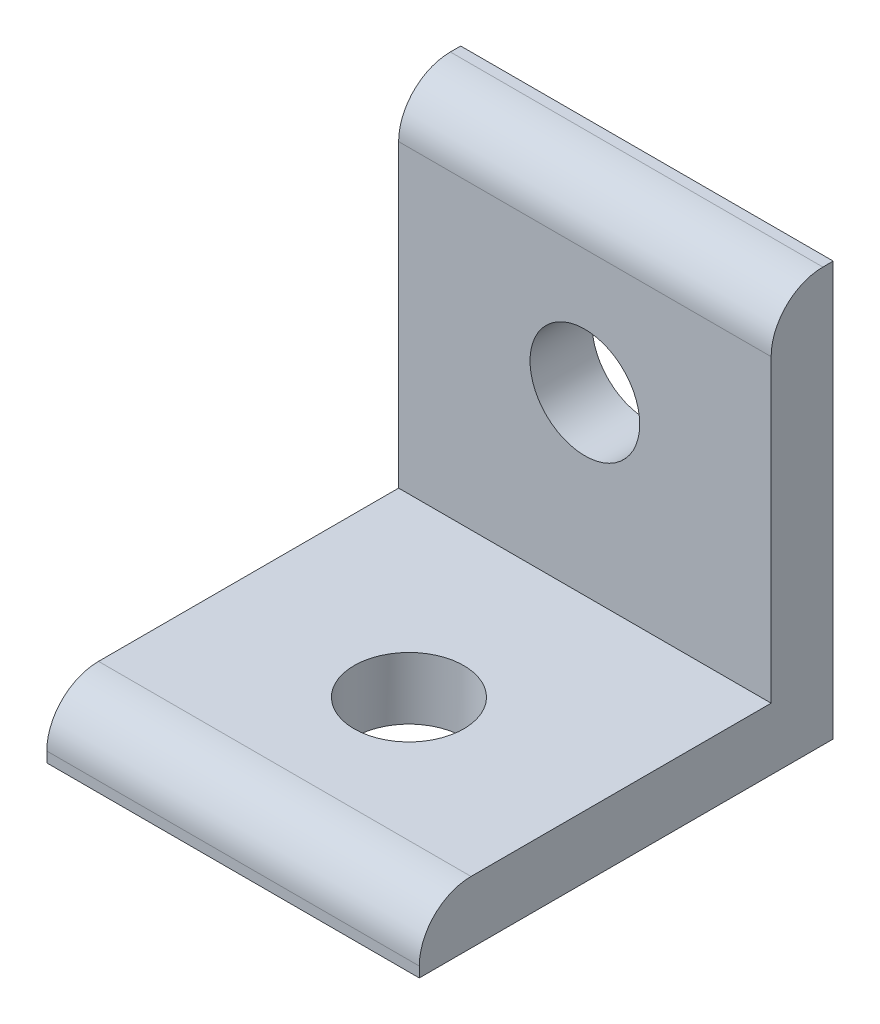
ISO-10303-21;
HEADER;
FILE_DESCRIPTION(('STEP AP214'),'2;1');
FILE_NAME('part.step','',(''),(''),'','','');
FILE_SCHEMA(('AUTOMOTIVE_DESIGN { 1 0 10303 214 1 1 1 1 }'));
ENDSEC;
DATA;
#1=APPLICATION_CONTEXT('core data for automotive mechanical design processes');
#2=APPLICATION_PROTOCOL_DEFINITION('international standard','automotive_design',2000,#1);
#3=PRODUCT_CONTEXT('',#1,'mechanical');
#4=PRODUCT('Part','Part','',(#3));
#5=PRODUCT_RELATED_PRODUCT_CATEGORY('part','',(#4));
#6=PRODUCT_DEFINITION_FORMATION('','',#4);
#7=PRODUCT_DEFINITION_CONTEXT('part definition',#1,'design');
#8=PRODUCT_DEFINITION('design','',#6,#7);
#9=PRODUCT_DEFINITION_SHAPE('','',#8);
#10=(LENGTH_UNIT() NAMED_UNIT(*) SI_UNIT(.MILLI.,.METRE.));
#11=(NAMED_UNIT(*) PLANE_ANGLE_UNIT() SI_UNIT($,.RADIAN.));
#12=(NAMED_UNIT(*) SI_UNIT($,.STERADIAN.) SOLID_ANGLE_UNIT());
#13=UNCERTAINTY_MEASURE_WITH_UNIT(LENGTH_MEASURE(1.E-05),#10,'distance_accuracy_value','');
#14=(GEOMETRIC_REPRESENTATION_CONTEXT(3) GLOBAL_UNCERTAINTY_ASSIGNED_CONTEXT((#13)) GLOBAL_UNIT_ASSIGNED_CONTEXT((#10,
#11,#12)) REPRESENTATION_CONTEXT('',''));
#15=CARTESIAN_POINT('',(0.,0.,0.));
#16=DIRECTION('',(0.,0.,1.));
#17=DIRECTION('',(1.,0.,0.));
#18=AXIS2_PLACEMENT_3D('',#15,#16,#17);
#19=CARTESIAN_POINT('',(0.,3.,0.));
#20=DIRECTION('',(0.,-1.,0.));
#21=DIRECTION('',(0.,0.,-1.));
#22=AXIS2_PLACEMENT_3D('',#19,#20,#21);
#23=PLANE('',#22);
#24=CARTESIAN_POINT('',(9.00000000000001,3.,11.5));
#25=DIRECTION('',(0.,1.,0.));
#26=DIRECTION('',(0.,0.,1.));
#27=AXIS2_PLACEMENT_3D('',#24,#25,#26);
#28=CIRCLE('',#27,2.65);
#29=CARTESIAN_POINT('',(9.00000000000001,3.,14.15));
#30=VERTEX_POINT('',#29);
#31=EDGE_CURVE('E227',#30,#30,#28,.T.);
#32=ORIENTED_EDGE('',*,*,#31,.F.);
#33=EDGE_LOOP('',(#32));
#34=FACE_BOUND('',#33,.T.);
#35=DIRECTION('',(0.,0.,-1.));
#36=VECTOR('',#35,1.);
#37=CARTESIAN_POINT('',(0.,3.,20.));
#38=LINE('',#37,#36);
#39=CARTESIAN_POINT('',(0.,3.,17.5));
#40=VERTEX_POINT('',#39);
#41=CARTESIAN_POINT('',(0.,3.,3.));
#42=VERTEX_POINT('',#41);
#43=EDGE_CURVE('E145',#40,#42,#38,.T.);
#44=ORIENTED_EDGE('',*,*,#43,.F.);
#45=DIRECTION('',(-1.,0.,0.));
#46=VECTOR('',#45,1.);
#47=CARTESIAN_POINT('',(18.,3.,17.5));
#48=LINE('',#47,#46);
#49=CARTESIAN_POINT('',(18.,3.,17.5));
#50=VERTEX_POINT('',#49);
#51=EDGE_CURVE('E11',#40,#50,#48,.F.);
#52=ORIENTED_EDGE('',*,*,#51,.T.);
#53=DIRECTION('',(0.,0.,1.));
#54=VECTOR('',#53,1.);
#55=CARTESIAN_POINT('',(18.,3.,0.));
#56=LINE('',#55,#54);
#57=CARTESIAN_POINT('',(18.,3.,3.));
#58=VERTEX_POINT('',#57);
#59=EDGE_CURVE('E147',#58,#50,#56,.T.);
#60=ORIENTED_EDGE('',*,*,#59,.F.);
#61=DIRECTION('',(1.,0.,0.));
#62=VECTOR('',#61,1.);
#63=CARTESIAN_POINT('',(18.,3.,3.));
#64=LINE('',#63,#62);
#65=EDGE_CURVE('E138',#42,#58,#64,.T.);
#66=ORIENTED_EDGE('',*,*,#65,.F.);
#67=EDGE_LOOP('',(#44,#52,#60,#66));
#68=FACE_BOUND('',#67,.T.);
#69=ADVANCED_FACE('F43',(#34,#68),#23,.F.);
#70=CARTESIAN_POINT('',(18.,3.,20.));
#71=DIRECTION('',(0.,0.,1.));
#72=DIRECTION('',(1.,0.,0.));
#73=AXIS2_PLACEMENT_3D('',#70,#71,#72);
#74=PLANE('',#73);
#75=DIRECTION('',(0.,-1.,0.));
#76=VECTOR('',#75,1.);
#77=CARTESIAN_POINT('',(18.,3.,20.));
#78=LINE('',#77,#76);
#79=CARTESIAN_POINT('',(18.,0.5,20.));
#80=VERTEX_POINT('',#79);
#81=CARTESIAN_POINT('',(18.,0.,20.));
#82=VERTEX_POINT('',#81);
#83=EDGE_CURVE('E128',#80,#82,#78,.T.);
#84=ORIENTED_EDGE('',*,*,#83,.F.);
#85=DIRECTION('',(-1.,0.,0.));
#86=VECTOR('',#85,1.);
#87=CARTESIAN_POINT('',(0.,0.5,20.));
#88=LINE('',#87,#86);
#89=CARTESIAN_POINT('',(0.,0.5,20.));
#90=VERTEX_POINT('',#89);
#91=EDGE_CURVE('E51',#80,#90,#88,.T.);
#92=ORIENTED_EDGE('',*,*,#91,.T.);
#93=DIRECTION('',(0.,-1.,0.));
#94=VECTOR('',#93,1.);
#95=CARTESIAN_POINT('',(0.,3.,20.));
#96=LINE('',#95,#94);
#97=CARTESIAN_POINT('',(0.,0.,20.));
#98=VERTEX_POINT('',#97);
#99=EDGE_CURVE('E150',#90,#98,#96,.T.);
#100=ORIENTED_EDGE('',*,*,#99,.T.);
#101=DIRECTION('',(-1.,0.,0.));
#102=VECTOR('',#101,1.);
#103=CARTESIAN_POINT('',(18.,0.,20.));
#104=LINE('',#103,#102);
#105=EDGE_CURVE('E144',#82,#98,#104,.T.);
#106=ORIENTED_EDGE('',*,*,#105,.F.);
#107=EDGE_LOOP('',(#84,#92,#100,#106));
#108=FACE_BOUND('',#107,.T.);
#109=ADVANCED_FACE('F173',(#108),#74,.T.);
#110=CARTESIAN_POINT('',(18.,3.,0.));
#111=DIRECTION('',(1.,0.,0.));
#112=DIRECTION('',(0.,0.,-1.));
#113=AXIS2_PLACEMENT_3D('',#110,#111,#112);
#114=PLANE('',#113);
#115=DIRECTION('',(0.,0.,-1.));
#116=VECTOR('',#115,1.);
#117=CARTESIAN_POINT('',(18.,20.,0.));
#118=LINE('',#117,#116);
#119=CARTESIAN_POINT('',(18.,20.,0.5));
#120=VERTEX_POINT('',#119);
#121=CARTESIAN_POINT('',(18.,20.,0.));
#122=VERTEX_POINT('',#121);
#123=EDGE_CURVE('E108',#120,#122,#118,.T.);
#124=ORIENTED_EDGE('',*,*,#123,.F.);
#125=CARTESIAN_POINT('',(18.,17.5,0.5));
#126=DIRECTION('',(1.,0.,0.));
#127=DIRECTION('',(0.,0.,-1.));
#128=AXIS2_PLACEMENT_3D('',#125,#126,#127);
#129=CIRCLE('',#128,2.5);
#130=CARTESIAN_POINT('',(18.,17.5,3.));
#131=VERTEX_POINT('',#130);
#132=EDGE_CURVE('E165',#120,#131,#129,.T.);
#133=ORIENTED_EDGE('',*,*,#132,.T.);
#134=DIRECTION('',(0.,-1.,0.));
#135=VECTOR('',#134,1.);
#136=CARTESIAN_POINT('',(18.,20.,3.));
#137=LINE('',#136,#135);
#138=EDGE_CURVE('E132',#131,#58,#137,.T.);
#139=ORIENTED_EDGE('',*,*,#138,.T.);
#140=ORIENTED_EDGE('',*,*,#59,.T.);
#141=CARTESIAN_POINT('',(18.,0.5,17.5));
#142=DIRECTION('',(1.,0.,0.));
#143=DIRECTION('',(0.,0.,-1.));
#144=AXIS2_PLACEMENT_3D('',#141,#142,#143);
#145=CIRCLE('',#144,2.5);
#146=EDGE_CURVE('E163',#50,#80,#145,.T.);
#147=ORIENTED_EDGE('',*,*,#146,.T.);
#148=ORIENTED_EDGE('',*,*,#83,.T.);
#149=DIRECTION('',(0.,0.,1.));
#150=VECTOR('',#149,1.);
#151=CARTESIAN_POINT('',(18.,0.,0.));
#152=LINE('',#151,#150);
#153=CARTESIAN_POINT('',(18.,0.,0.));
#154=VERTEX_POINT('',#153);
#155=EDGE_CURVE('E124',#154,#82,#152,.T.);
#156=ORIENTED_EDGE('',*,*,#155,.F.);
#157=DIRECTION('',(0.,-1.,0.));
#158=VECTOR('',#157,1.);
#159=CARTESIAN_POINT('',(18.,3.,0.));
#160=LINE('',#159,#158);
#161=EDGE_CURVE('E121',#122,#154,#160,.T.);
#162=ORIENTED_EDGE('',*,*,#161,.F.);
#163=EDGE_LOOP('',(#124,#133,#139,#140,#147,#148,#156,#162));
#164=FACE_BOUND('',#163,.T.);
#165=ADVANCED_FACE('F122',(#164),#114,.T.);
#166=CARTESIAN_POINT('',(0.,3.,0.));
#167=DIRECTION('',(0.,0.,-1.));
#168=DIRECTION('',(-1.,0.,0.));
#169=AXIS2_PLACEMENT_3D('',#166,#167,#168);
#170=PLANE('',#169);
#171=CARTESIAN_POINT('',(9.,11.5,0.));
#172=DIRECTION('',(0.,0.,-1.));
#173=DIRECTION('',(-1.,0.,0.));
#174=AXIS2_PLACEMENT_3D('',#171,#172,#173);
#175=CIRCLE('',#174,2.65);
#176=CARTESIAN_POINT('',(11.65,11.5,0.));
#177=VERTEX_POINT('',#176);
#178=EDGE_CURVE('E225',#177,#177,#175,.F.);
#179=ORIENTED_EDGE('',*,*,#178,.T.);
#180=EDGE_LOOP('',(#179));
#181=FACE_BOUND('',#180,.T.);
#182=DIRECTION('',(1.,0.,0.));
#183=VECTOR('',#182,1.);
#184=CARTESIAN_POINT('',(0.,0.,0.));
#185=LINE('',#184,#183);
#186=CARTESIAN_POINT('',(0.,0.,0.));
#187=VERTEX_POINT('',#186);
#188=EDGE_CURVE('E156',#187,#154,#185,.T.);
#189=ORIENTED_EDGE('',*,*,#188,.F.);
#190=DIRECTION('',(0.,-1.,0.));
#191=VECTOR('',#190,1.);
#192=CARTESIAN_POINT('',(0.,3.,0.));
#193=LINE('',#192,#191);
#194=CARTESIAN_POINT('',(0.,20.,0.));
#195=VERTEX_POINT('',#194);
#196=EDGE_CURVE('E129',#195,#187,#193,.T.);
#197=ORIENTED_EDGE('',*,*,#196,.F.);
#198=DIRECTION('',(-1.,0.,0.));
#199=VECTOR('',#198,1.);
#200=CARTESIAN_POINT('',(0.,20.,0.));
#201=LINE('',#200,#199);
#202=EDGE_CURVE('E113',#122,#195,#201,.T.);
#203=ORIENTED_EDGE('',*,*,#202,.F.);
#204=ORIENTED_EDGE('',*,*,#161,.T.);
#205=EDGE_LOOP('',(#189,#197,#203,#204));
#206=FACE_BOUND('',#205,.T.);
#207=ADVANCED_FACE('F131',(#181,#206),#170,.T.);
#208=CARTESIAN_POINT('',(0.,3.,20.));
#209=DIRECTION('',(-1.,0.,0.));
#210=DIRECTION('',(0.,0.,1.));
#211=AXIS2_PLACEMENT_3D('',#208,#209,#210);
#212=PLANE('',#211);
#213=DIRECTION('',(0.,-1.,0.));
#214=VECTOR('',#213,1.);
#215=CARTESIAN_POINT('',(0.,20.,3.));
#216=LINE('',#215,#214);
#217=CARTESIAN_POINT('',(0.,17.5,3.));
#218=VERTEX_POINT('',#217);
#219=EDGE_CURVE('E134',#218,#42,#216,.T.);
#220=ORIENTED_EDGE('',*,*,#219,.F.);
#221=CARTESIAN_POINT('',(0.,17.5,0.500000000000003));
#222=DIRECTION('',(-1.,0.,0.));
#223=DIRECTION('',(0.,0.,1.));
#224=AXIS2_PLACEMENT_3D('',#221,#222,#223);
#225=CIRCLE('',#224,2.5);
#226=CARTESIAN_POINT('',(0.,20.,0.500000000000003));
#227=VERTEX_POINT('',#226);
#228=EDGE_CURVE('E170',#218,#227,#225,.T.);
#229=ORIENTED_EDGE('',*,*,#228,.T.);
#230=DIRECTION('',(0.,0.,1.));
#231=VECTOR('',#230,1.);
#232=CARTESIAN_POINT('',(0.,20.,3.));
#233=LINE('',#232,#231);
#234=EDGE_CURVE('E118',#195,#227,#233,.T.);
#235=ORIENTED_EDGE('',*,*,#234,.F.);
#236=ORIENTED_EDGE('',*,*,#196,.T.);
#237=DIRECTION('',(0.,0.,-1.));
#238=VECTOR('',#237,1.);
#239=CARTESIAN_POINT('',(0.,0.,20.));
#240=LINE('',#239,#238);
#241=EDGE_CURVE('E153',#98,#187,#240,.T.);
#242=ORIENTED_EDGE('',*,*,#241,.F.);
#243=ORIENTED_EDGE('',*,*,#99,.F.);
#244=CARTESIAN_POINT('',(0.,0.5,17.5));
#245=DIRECTION('',(-1.,0.,0.));
#246=DIRECTION('',(0.,0.,1.));
#247=AXIS2_PLACEMENT_3D('',#244,#245,#246);
#248=CIRCLE('',#247,2.5);
#249=EDGE_CURVE('E58',#90,#40,#248,.T.);
#250=ORIENTED_EDGE('',*,*,#249,.T.);
#251=ORIENTED_EDGE('',*,*,#43,.T.);
#252=EDGE_LOOP('',(#220,#229,#235,#236,#242,#243,#250,#251));
#253=FACE_BOUND('',#252,.T.);
#254=ADVANCED_FACE('F178',(#253),#212,.T.);
#255=CARTESIAN_POINT('',(0.,0.,0.));
#256=DIRECTION('',(0.,-1.,0.));
#257=DIRECTION('',(0.,0.,-1.));
#258=AXIS2_PLACEMENT_3D('',#255,#256,#257);
#259=PLANE('',#258);
#260=CARTESIAN_POINT('',(9.00000000000001,0.,11.5));
#261=DIRECTION('',(0.,-1.,0.));
#262=DIRECTION('',(0.,0.,-1.));
#263=AXIS2_PLACEMENT_3D('',#260,#261,#262);
#264=CIRCLE('',#263,2.65);
#265=CARTESIAN_POINT('',(9.00000000000001,0.,8.85));
#266=VERTEX_POINT('',#265);
#267=EDGE_CURVE('E140',#266,#266,#264,.F.);
#268=ORIENTED_EDGE('',*,*,#267,.T.);
#269=EDGE_LOOP('',(#268));
#270=FACE_BOUND('',#269,.T.);
#271=ORIENTED_EDGE('',*,*,#105,.T.);
#272=ORIENTED_EDGE('',*,*,#241,.T.);
#273=ORIENTED_EDGE('',*,*,#188,.T.);
#274=ORIENTED_EDGE('',*,*,#155,.T.);
#275=EDGE_LOOP('',(#271,#272,#273,#274));
#276=FACE_BOUND('',#275,.T.);
#277=ADVANCED_FACE('F180',(#270,#276),#259,.T.);
#278=CARTESIAN_POINT('',(18.,20.,3.));
#279=DIRECTION('',(0.,0.,-1.));
#280=DIRECTION('',(-1.,0.,0.));
#281=AXIS2_PLACEMENT_3D('',#278,#279,#280);
#282=PLANE('',#281);
#283=CARTESIAN_POINT('',(9.,11.5,3.));
#284=DIRECTION('',(0.,0.,1.));
#285=DIRECTION('',(1.,0.,0.));
#286=AXIS2_PLACEMENT_3D('',#283,#284,#285);
#287=CIRCLE('',#286,2.65);
#288=CARTESIAN_POINT('',(11.65,11.5,3.));
#289=VERTEX_POINT('',#288);
#290=EDGE_CURVE('E222',#289,#289,#287,.T.);
#291=ORIENTED_EDGE('',*,*,#290,.F.);
#292=EDGE_LOOP('',(#291));
#293=FACE_BOUND('',#292,.T.);
#294=ORIENTED_EDGE('',*,*,#138,.F.);
#295=DIRECTION('',(1.,0.,0.));
#296=VECTOR('',#295,1.);
#297=CARTESIAN_POINT('',(18.,17.5,3.));
#298=LINE('',#297,#296);
#299=EDGE_CURVE('E167',#131,#218,#298,.F.);
#300=ORIENTED_EDGE('',*,*,#299,.T.);
#301=ORIENTED_EDGE('',*,*,#219,.T.);
#302=ORIENTED_EDGE('',*,*,#65,.T.);
#303=EDGE_LOOP('',(#294,#300,#301,#302));
#304=FACE_BOUND('',#303,.T.);
#305=ADVANCED_FACE('F182',(#293,#304),#282,.F.);
#306=CARTESIAN_POINT('',(0.,20.,0.));
#307=DIRECTION('',(0.,-1.,0.));
#308=DIRECTION('',(0.,0.,-1.));
#309=AXIS2_PLACEMENT_3D('',#306,#307,#308);
#310=PLANE('',#309);
#311=ORIENTED_EDGE('',*,*,#234,.T.);
#312=DIRECTION('',(1.,0.,0.));
#313=VECTOR('',#312,1.);
#314=CARTESIAN_POINT('',(0.,20.,0.500000000000003));
#315=LINE('',#314,#313);
#316=EDGE_CURVE('E116',#227,#120,#315,.T.);
#317=ORIENTED_EDGE('',*,*,#316,.T.);
#318=ORIENTED_EDGE('',*,*,#123,.T.);
#319=ORIENTED_EDGE('',*,*,#202,.T.);
#320=EDGE_LOOP('',(#311,#317,#318,#319));
#321=FACE_BOUND('',#320,.T.);
#322=ADVANCED_FACE('F111',(#321),#310,.F.);
#323=CARTESIAN_POINT('',(9.00000000000001,-7.4953318805774,11.5));
#324=DIRECTION('',(0.,1.,0.));
#325=DIRECTION('',(0.,0.,1.));
#326=AXIS2_PLACEMENT_3D('',#323,#324,#325);
#327=CYLINDRICAL_SURFACE('',#326,2.65);
#328=ORIENTED_EDGE('',*,*,#31,.T.);
#329=EDGE_LOOP('',(#328));
#330=FACE_BOUND('',#329,.T.);
#331=ORIENTED_EDGE('',*,*,#267,.F.);
#332=EDGE_LOOP('',(#331));
#333=FACE_BOUND('',#332,.T.);
#334=ADVANCED_FACE('F208',(#330,#333),#327,.F.);
#335=CARTESIAN_POINT('',(9.,11.5,-7.4953318805774));
#336=DIRECTION('',(0.,0.,1.));
#337=DIRECTION('',(1.,0.,0.));
#338=AXIS2_PLACEMENT_3D('',#335,#336,#337);
#339=CYLINDRICAL_SURFACE('',#338,2.65);
#340=CARTESIAN_POINT('',(11.65,11.5,3.));
#341=CARTESIAN_POINT('',(11.65,11.5,2.96875));
#342=CARTESIAN_POINT('',(11.65,11.5,2.9375));
#343=CARTESIAN_POINT('',(11.65,11.5,2.875));
#344=CARTESIAN_POINT('',(11.65,11.5,2.84375));
#345=CARTESIAN_POINT('',(11.65,11.5,2.78125));
#346=CARTESIAN_POINT('',(11.65,11.5,2.75));
#347=CARTESIAN_POINT('',(11.65,11.5,2.6875));
#348=CARTESIAN_POINT('',(11.65,11.5,2.65625));
#349=CARTESIAN_POINT('',(11.65,11.5,2.59375));
#350=CARTESIAN_POINT('',(11.65,11.5,2.5625));
#351=CARTESIAN_POINT('',(11.65,11.5,2.5));
#352=CARTESIAN_POINT('',(11.65,11.5,2.46875));
#353=CARTESIAN_POINT('',(11.65,11.5,2.40625));
#354=CARTESIAN_POINT('',(11.65,11.5,2.375));
#355=CARTESIAN_POINT('',(11.65,11.5,2.3125));
#356=CARTESIAN_POINT('',(11.65,11.5,2.28125));
#357=CARTESIAN_POINT('',(11.65,11.5,2.21875));
#358=CARTESIAN_POINT('',(11.65,11.5,2.1875));
#359=CARTESIAN_POINT('',(11.65,11.5,2.125));
#360=CARTESIAN_POINT('',(11.65,11.5,2.09375));
#361=CARTESIAN_POINT('',(11.65,11.5,2.03125));
#362=CARTESIAN_POINT('',(11.65,11.5,2.));
#363=CARTESIAN_POINT('',(11.65,11.5,1.9375));
#364=CARTESIAN_POINT('',(11.65,11.5,1.90625));
#365=CARTESIAN_POINT('',(11.65,11.5,1.84375));
#366=CARTESIAN_POINT('',(11.65,11.5,1.8125));
#367=CARTESIAN_POINT('',(11.65,11.5,1.75));
#368=CARTESIAN_POINT('',(11.65,11.5,1.71875));
#369=CARTESIAN_POINT('',(11.65,11.5,1.65625));
#370=CARTESIAN_POINT('',(11.65,11.5,1.625));
#371=CARTESIAN_POINT('',(11.65,11.5,1.5625));
#372=CARTESIAN_POINT('',(11.65,11.5,1.53125));
#373=CARTESIAN_POINT('',(11.65,11.5,1.46875));
#374=CARTESIAN_POINT('',(11.65,11.5,1.4375));
#375=CARTESIAN_POINT('',(11.65,11.5,1.375));
#376=CARTESIAN_POINT('',(11.65,11.5,1.34375));
#377=CARTESIAN_POINT('',(11.65,11.5,1.28125));
#378=CARTESIAN_POINT('',(11.65,11.5,1.25));
#379=CARTESIAN_POINT('',(11.65,11.5,1.1875));
#380=CARTESIAN_POINT('',(11.65,11.5,1.15625));
#381=CARTESIAN_POINT('',(11.65,11.5,1.09375));
#382=CARTESIAN_POINT('',(11.65,11.5,1.0625));
#383=CARTESIAN_POINT('',(11.65,11.5,1.));
#384=CARTESIAN_POINT('',(11.65,11.5,0.968750000000001));
#385=CARTESIAN_POINT('',(11.65,11.5,0.906250000000001));
#386=CARTESIAN_POINT('',(11.65,11.5,0.875000000000001));
#387=CARTESIAN_POINT('',(11.65,11.5,0.812500000000001));
#388=CARTESIAN_POINT('',(11.65,11.5,0.781250000000001));
#389=CARTESIAN_POINT('',(11.65,11.5,0.718750000000001));
#390=CARTESIAN_POINT('',(11.65,11.5,0.687500000000001));
#391=CARTESIAN_POINT('',(11.65,11.5,0.625000000000001));
#392=CARTESIAN_POINT('',(11.65,11.5,0.593750000000001));
#393=CARTESIAN_POINT('',(11.65,11.5,0.53125));
#394=CARTESIAN_POINT('',(11.65,11.5,0.5));
#395=CARTESIAN_POINT('',(11.65,11.5,0.4375));
#396=CARTESIAN_POINT('',(11.65,11.5,0.40625));
#397=CARTESIAN_POINT('',(11.65,11.5,0.343750000000001));
#398=CARTESIAN_POINT('',(11.65,11.5,0.312500000000001));
#399=CARTESIAN_POINT('',(11.65,11.5,0.250000000000001));
#400=CARTESIAN_POINT('',(11.65,11.5,0.218750000000001));
#401=CARTESIAN_POINT('',(11.65,11.5,0.156250000000001));
#402=CARTESIAN_POINT('',(11.65,11.5,0.125000000000001));
#403=CARTESIAN_POINT('',(11.65,11.5,0.0625000000000009));
#404=CARTESIAN_POINT('',(11.65,11.5,0.0312500000000009));
#405=CARTESIAN_POINT('',(11.65,11.5,0.));
#406=B_SPLINE_CURVE_WITH_KNOTS('',3,(#340,#341,#342,#343,#344,#345,#346,#347,#348,#349,#350,
#351,#352,#353,#354,#355,#356,#357,#358,#359,#360,#361,#362,#363,#364,#365,#366,#367,#368,#369,
#370,#371,#372,#373,#374,#375,#376,#377,#378,#379,#380,#381,#382,#383,#384,#385,#386,#387,#388,
#389,#390,#391,#392,#393,#394,#395,#396,#397,#398,#399,#400,#401,#402,#403,#404,#405),
.UNSPECIFIED.,.F.,.F.,(4,2,2,2,2,2,2,2,2,2,2,2,2,2,2,2,2,2,2,2,2,2,2,2,2,2,2,2,2,2,2,2,4),(0.,
0.0937500000000001,0.1875,0.28125,0.375,0.46875,0.5625,0.656250000000001,0.750000000000001,
0.843750000000001,0.937500000000001,1.03125,1.125,1.21875,1.3125,1.40625,1.5,1.59375,1.6875,
1.78125,1.875,1.96875,2.0625,2.15625,2.25,2.34375,2.4375,2.53125,2.625,2.71875,2.8125,2.90625,
3.),.UNSPECIFIED.);
#407=EDGE_CURVE('BSEAM210',#289,#177,#406,.T.);
#408=ORIENTED_EDGE('',*,*,#290,.T.);
#409=ORIENTED_EDGE('',*,*,#178,.F.);
#410=ORIENTED_EDGE('',*,*,#407,.T.);
#411=ORIENTED_EDGE('',*,*,#407,.F.);
#412=EDGE_LOOP('',(#408,#410,#409,#411));
#413=FACE_BOUND('',#412,.T.);
#414=ADVANCED_FACE('F210',(#413),#339,.F.);
#415=CARTESIAN_POINT('',(0.,17.5,0.500000000000003));
#416=DIRECTION('',(1.,0.,0.));
#417=DIRECTION('',(0.,0.,-1.));
#418=AXIS2_PLACEMENT_3D('',#415,#416,#417);
#419=CYLINDRICAL_SURFACE('',#418,2.5);
#420=ORIENTED_EDGE('',*,*,#228,.F.);
#421=ORIENTED_EDGE('',*,*,#299,.F.);
#422=ORIENTED_EDGE('',*,*,#132,.F.);
#423=ORIENTED_EDGE('',*,*,#316,.F.);
#424=EDGE_LOOP('',(#420,#421,#422,#423));
#425=FACE_BOUND('',#424,.T.);
#426=ADVANCED_FACE('F212',(#425),#419,.T.);
#427=CARTESIAN_POINT('',(18.,0.5,17.5));
#428=DIRECTION('',(1.,0.,0.));
#429=DIRECTION('',(0.,0.,-1.));
#430=AXIS2_PLACEMENT_3D('',#427,#428,#429);
#431=CYLINDRICAL_SURFACE('',#430,2.5);
#432=ORIENTED_EDGE('',*,*,#146,.F.);
#433=ORIENTED_EDGE('',*,*,#51,.F.);
#434=ORIENTED_EDGE('',*,*,#249,.F.);
#435=ORIENTED_EDGE('',*,*,#91,.F.);
#436=EDGE_LOOP('',(#432,#433,#434,#435));
#437=FACE_BOUND('',#436,.T.);
#438=ADVANCED_FACE('F45',(#437),#431,.T.);
#439=CLOSED_SHELL('',(#69,#109,#165,#207,#254,#277,#305,#322,#334,#414,#426,#438));
#440=MANIFOLD_SOLID_BREP('B2',#439);
#441=ADVANCED_BREP_SHAPE_REPRESENTATION('',(#18,#440),#14);
#442=SHAPE_DEFINITION_REPRESENTATION(#9,#441);
ENDSEC;
END-ISO-10303-21;
